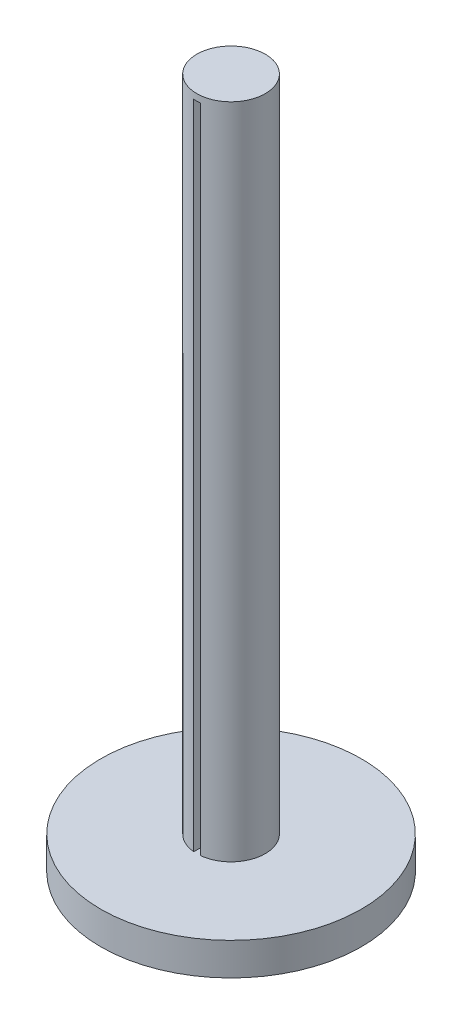
ISO-10303-21;
HEADER;
FILE_DESCRIPTION(('STEP AP214'),'2;1');
FILE_NAME('part.step','',(''),(''),'','','');
FILE_SCHEMA(('AUTOMOTIVE_DESIGN { 1 0 10303 214 1 1 1 1 }'));
ENDSEC;
DATA;
#1=APPLICATION_CONTEXT('core data for automotive mechanical design processes');
#2=APPLICATION_PROTOCOL_DEFINITION('international standard','automotive_design',2000,#1);
#3=PRODUCT_CONTEXT('',#1,'mechanical');
#4=PRODUCT('Part','Part','',(#3));
#5=PRODUCT_RELATED_PRODUCT_CATEGORY('part','',(#4));
#6=PRODUCT_DEFINITION_FORMATION('','',#4);
#7=PRODUCT_DEFINITION_CONTEXT('part definition',#1,'design');
#8=PRODUCT_DEFINITION('design','',#6,#7);
#9=PRODUCT_DEFINITION_SHAPE('','',#8);
#10=(LENGTH_UNIT() NAMED_UNIT(*) SI_UNIT(.MILLI.,.METRE.));
#11=(NAMED_UNIT(*) PLANE_ANGLE_UNIT() SI_UNIT($,.RADIAN.));
#12=(NAMED_UNIT(*) SI_UNIT($,.STERADIAN.) SOLID_ANGLE_UNIT());
#13=UNCERTAINTY_MEASURE_WITH_UNIT(LENGTH_MEASURE(1.E-05),#10,'distance_accuracy_value','');
#14=(GEOMETRIC_REPRESENTATION_CONTEXT(3) GLOBAL_UNCERTAINTY_ASSIGNED_CONTEXT((#13)) GLOBAL_UNIT_ASSIGNED_CONTEXT((#10,
#11,#12)) REPRESENTATION_CONTEXT('',''));
#15=CARTESIAN_POINT('',(0.,0.,0.));
#16=DIRECTION('',(0.,0.,1.));
#17=DIRECTION('',(1.,0.,0.));
#18=AXIS2_PLACEMENT_3D('',#15,#16,#17);
#19=CARTESIAN_POINT('',(-3.53710116751671E-12,50.0000000000016,0.));
#20=DIRECTION('',(0.,1.,0.));
#21=DIRECTION('',(0.,0.,-1.));
#22=AXIS2_PLACEMENT_3D('',#19,#20,#21);
#23=CYLINDRICAL_SURFACE('',#22,52.5);
#24=CARTESIAN_POINT('',(-3.53710116751671E-12,50.0000000000016,0.));
#25=DIRECTION('',(0.,-1.,0.));
#26=DIRECTION('',(0.,0.,1.));
#27=AXIS2_PLACEMENT_3D('',#24,#25,#26);
#28=CIRCLE('',#27,52.5);
#29=CARTESIAN_POINT('',(-5.00000000000355,50.0000000000016,52.2613624009172));
#30=VERTEX_POINT('',#29);
#31=CARTESIAN_POINT('',(4.99999999999645,50.0000000000016,52.2613624009172));
#32=VERTEX_POINT('',#31);
#33=EDGE_CURVE('E11',#30,#32,#28,.T.);
#34=ORIENTED_EDGE('',*,*,#33,.F.);
#35=DIRECTION('',(0.,-1.,0.));
#36=VECTOR('',#35,1.);
#37=CARTESIAN_POINT('',(-4.99999999999255,1050.,52.2613624009172));
#38=LINE('',#37,#36);
#39=CARTESIAN_POINT('',(-4.99999999999255,1050.,52.2613624009172));
#40=VERTEX_POINT('',#39);
#41=EDGE_CURVE('E79',#40,#30,#38,.T.);
#42=ORIENTED_EDGE('',*,*,#41,.F.);
#43=CARTESIAN_POINT('',(1.15516970988772E-11,1050.,0.));
#44=DIRECTION('',(0.,1.,0.));
#45=DIRECTION('',(-1.,0.,0.));
#46=AXIS2_PLACEMENT_3D('',#43,#44,#45);
#47=CIRCLE('',#46,52.499999999997);
#48=CARTESIAN_POINT('',(5.00000000000745,1050.,52.2613624009146));
#49=VERTEX_POINT('',#48);
#50=EDGE_CURVE('E86',#40,#49,#47,.T.);
#51=ORIENTED_EDGE('',*,*,#50,.T.);
#52=DIRECTION('',(0.,-1.,0.));
#53=VECTOR('',#52,1.);
#54=CARTESIAN_POINT('',(5.00000000000745,1050.,52.2613624009172));
#55=LINE('',#54,#53);
#56=EDGE_CURVE('E70',#49,#32,#55,.T.);
#57=ORIENTED_EDGE('',*,*,#56,.T.);
#58=EDGE_LOOP('',(#34,#42,#51,#57));
#59=FACE_BOUND('',#58,.T.);
#60=CARTESIAN_POINT('',(1.16617132617236E-11,1060.,0.));
#61=DIRECTION('',(0.,1.,0.));
#62=DIRECTION('',(-1.,0.,0.));
#63=AXIS2_PLACEMENT_3D('',#60,#61,#62);
#64=CIRCLE('',#63,52.499999999997);
#65=CARTESIAN_POINT('',(-52.4999999999853,1060.,0.));
#66=VERTEX_POINT('',#65);
#67=EDGE_CURVE('E92',#66,#66,#64,.T.);
#68=ORIENTED_EDGE('',*,*,#67,.F.);
#69=EDGE_LOOP('',(#68));
#70=FACE_BOUND('',#69,.T.);
#71=ADVANCED_FACE('F33',(#59,#70),#23,.T.);
#72=CARTESIAN_POINT('',(7.4645151171282E-12,1050.,0.));
#73=DIRECTION('',(0.,-1.,0.));
#74=DIRECTION('',(0.,0.,1.));
#75=AXIS2_PLACEMENT_3D('',#72,#73,#74);
#76=CYLINDRICAL_SURFACE('',#75,30.);
#77=CARTESIAN_POINT('',(-3.53710116751671E-12,50.0000000000016,0.));
#78=DIRECTION('',(0.,-1.,0.));
#79=DIRECTION('',(0.,0.,1.));
#80=AXIS2_PLACEMENT_3D('',#77,#78,#79);
#81=CIRCLE('',#80,30.);
#82=CARTESIAN_POINT('',(4.99999999999645,50.0000000000016,29.5803989154981));
#83=VERTEX_POINT('',#82);
#84=CARTESIAN_POINT('',(-5.00000000000355,50.0000000000016,29.5803989154981));
#85=VERTEX_POINT('',#84);
#86=EDGE_CURVE('E101',#83,#85,#81,.T.);
#87=ORIENTED_EDGE('',*,*,#86,.F.);
#88=DIRECTION('',(0.,-1.,0.));
#89=VECTOR('',#88,1.);
#90=CARTESIAN_POINT('',(5.00000000000746,1050.,29.5803989154981));
#91=LINE('',#90,#89);
#92=CARTESIAN_POINT('',(5.00000000000746,1050.,29.5803989154981));
#93=VERTEX_POINT('',#92);
#94=EDGE_CURVE('E80',#93,#83,#91,.T.);
#95=ORIENTED_EDGE('',*,*,#94,.F.);
#96=CARTESIAN_POINT('',(7.4645151171282E-12,1050.,0.));
#97=DIRECTION('',(0.,-1.,0.));
#98=DIRECTION('',(0.,0.,1.));
#99=AXIS2_PLACEMENT_3D('',#96,#97,#98);
#100=CIRCLE('',#99,30.);
#101=CARTESIAN_POINT('',(-4.99999999999255,1050.,29.5803989154981));
#102=VERTEX_POINT('',#101);
#103=EDGE_CURVE('E48',#93,#102,#100,.T.);
#104=ORIENTED_EDGE('',*,*,#103,.T.);
#105=DIRECTION('',(0.,-1.,0.));
#106=VECTOR('',#105,1.);
#107=CARTESIAN_POINT('',(-4.99999999999255,1050.,29.5803989154981));
#108=LINE('',#107,#106);
#109=EDGE_CURVE('E41',#102,#85,#108,.T.);
#110=ORIENTED_EDGE('',*,*,#109,.T.);
#111=EDGE_LOOP('',(#87,#95,#104,#110));
#112=FACE_BOUND('',#111,.T.);
#113=ADVANCED_FACE('F113',(#112),#76,.T.);
#114=CARTESIAN_POINT('',(-4.99999999999254,1050.,0.));
#115=DIRECTION('',(-1.,0.,0.));
#116=DIRECTION('',(0.,0.,-1.));
#117=AXIS2_PLACEMENT_3D('',#114,#115,#116);
#118=PLANE('',#117);
#119=DIRECTION('',(0.,0.,-1.));
#120=VECTOR('',#119,1.);
#121=CARTESIAN_POINT('',(-5.00000000000354,50.0000000000016,0.));
#122=LINE('',#121,#120);
#123=EDGE_CURVE('E104',#30,#85,#122,.T.);
#124=ORIENTED_EDGE('',*,*,#123,.T.);
#125=ORIENTED_EDGE('',*,*,#109,.F.);
#126=DIRECTION('',(0.,0.,-1.));
#127=VECTOR('',#126,1.);
#128=CARTESIAN_POINT('',(-4.99999999999254,1050.,0.));
#129=LINE('',#128,#127);
#130=EDGE_CURVE('E87',#40,#102,#129,.T.);
#131=ORIENTED_EDGE('',*,*,#130,.F.);
#132=ORIENTED_EDGE('',*,*,#41,.T.);
#133=EDGE_LOOP('',(#124,#125,#131,#132));
#134=FACE_BOUND('',#133,.T.);
#135=ADVANCED_FACE('F117',(#134),#118,.F.);
#136=CARTESIAN_POINT('',(5.00000000000746,1050.,0.));
#137=DIRECTION('',(1.,0.,0.));
#138=DIRECTION('',(0.,0.,1.));
#139=AXIS2_PLACEMENT_3D('',#136,#137,#138);
#140=PLANE('',#139);
#141=DIRECTION('',(0.,0.,1.));
#142=VECTOR('',#141,1.);
#143=CARTESIAN_POINT('',(4.99999999999646,50.0000000000016,0.));
#144=LINE('',#143,#142);
#145=EDGE_CURVE('E75',#83,#32,#144,.T.);
#146=ORIENTED_EDGE('',*,*,#145,.T.);
#147=ORIENTED_EDGE('',*,*,#56,.F.);
#148=DIRECTION('',(0.,0.,1.));
#149=VECTOR('',#148,1.);
#150=CARTESIAN_POINT('',(5.00000000000746,1050.,0.));
#151=LINE('',#150,#149);
#152=EDGE_CURVE('E74',#93,#49,#151,.T.);
#153=ORIENTED_EDGE('',*,*,#152,.F.);
#154=ORIENTED_EDGE('',*,*,#94,.T.);
#155=EDGE_LOOP('',(#146,#147,#153,#154));
#156=FACE_BOUND('',#155,.T.);
#157=ADVANCED_FACE('F72',(#156),#140,.F.);
#158=CARTESIAN_POINT('',(-3.53710116751671E-12,50.0000000000016,0.));
#159=DIRECTION('',(0.,-1.,0.));
#160=DIRECTION('',(0.,0.,1.));
#161=AXIS2_PLACEMENT_3D('',#158,#159,#160);
#162=PLANE('',#161);
#163=CARTESIAN_POINT('',(-3.53710116751671E-12,50.0000000000016,0.));
#164=DIRECTION('',(0.,-1.,0.));
#165=DIRECTION('',(0.,0.,1.));
#166=AXIS2_PLACEMENT_3D('',#163,#164,#165);
#167=CIRCLE('',#166,200.);
#168=CARTESIAN_POINT('',(-3.53710116751671E-12,50.0000000000016,200.));
#169=VERTEX_POINT('',#168);
#170=EDGE_CURVE('E95',#169,#169,#167,.T.);
#171=ORIENTED_EDGE('',*,*,#170,.F.);
#172=EDGE_LOOP('',(#171));
#173=FACE_BOUND('',#172,.T.);
#174=ORIENTED_EDGE('',*,*,#86,.T.);
#175=ORIENTED_EDGE('',*,*,#123,.F.);
#176=ORIENTED_EDGE('',*,*,#33,.T.);
#177=ORIENTED_EDGE('',*,*,#145,.F.);
#178=EDGE_LOOP('',(#174,#175,#176,#177));
#179=FACE_BOUND('',#178,.T.);
#180=ADVANCED_FACE('F115',(#173,#179),#162,.F.);
#181=CARTESIAN_POINT('',(-4.08718198174896E-12,1.55431223447522E-12,0.));
#182=DIRECTION('',(0.,1.,0.));
#183=DIRECTION('',(0.,0.,-1.));
#184=AXIS2_PLACEMENT_3D('',#181,#182,#183);
#185=CYLINDRICAL_SURFACE('',#184,200.);
#186=CARTESIAN_POINT('',(-4.08718198174896E-12,1.55431223447522E-12,0.));
#187=DIRECTION('',(0.,-1.,0.));
#188=DIRECTION('',(0.,0.,1.));
#189=AXIS2_PLACEMENT_3D('',#186,#187,#188);
#190=CIRCLE('',#189,200.);
#191=CARTESIAN_POINT('',(-4.08718198174896E-12,1.55431223447522E-12,200.));
#192=VERTEX_POINT('',#191);
#193=EDGE_CURVE('E98',#192,#192,#190,.T.);
#194=ORIENTED_EDGE('',*,*,#193,.F.);
#195=EDGE_LOOP('',(#194));
#196=FACE_BOUND('',#195,.T.);
#197=ORIENTED_EDGE('',*,*,#170,.T.);
#198=EDGE_LOOP('',(#197));
#199=FACE_BOUND('',#198,.T.);
#200=ADVANCED_FACE('F165',(#196,#199),#185,.T.);
#201=CARTESIAN_POINT('',(-4.08718198174896E-12,1.55431223447522E-12,0.));
#202=DIRECTION('',(0.,-1.,0.));
#203=DIRECTION('',(0.,0.,1.));
#204=AXIS2_PLACEMENT_3D('',#201,#202,#203);
#205=PLANE('',#204);
#206=ORIENTED_EDGE('',*,*,#193,.T.);
#207=EDGE_LOOP('',(#206));
#208=FACE_BOUND('',#207,.T.);
#209=ADVANCED_FACE('F134',(#208),#205,.T.);
#210=CARTESIAN_POINT('',(1.15516970988772E-11,1050.,0.));
#211=DIRECTION('',(0.,1.,0.));
#212=DIRECTION('',(-1.,0.,0.));
#213=AXIS2_PLACEMENT_3D('',#210,#211,#212);
#214=PLANE('',#213);
#215=ORIENTED_EDGE('',*,*,#50,.F.);
#216=ORIENTED_EDGE('',*,*,#130,.T.);
#217=ORIENTED_EDGE('',*,*,#103,.F.);
#218=ORIENTED_EDGE('',*,*,#152,.T.);
#219=EDGE_LOOP('',(#215,#216,#217,#218));
#220=FACE_BOUND('',#219,.T.);
#221=ADVANCED_FACE('F84',(#220),#214,.F.);
#222=CARTESIAN_POINT('',(1.16617132617236E-11,1060.,0.));
#223=DIRECTION('',(0.,1.,0.));
#224=DIRECTION('',(-1.,0.,0.));
#225=AXIS2_PLACEMENT_3D('',#222,#223,#224);
#226=PLANE('',#225);
#227=ORIENTED_EDGE('',*,*,#67,.T.);
#228=EDGE_LOOP('',(#227));
#229=FACE_BOUND('',#228,.T.);
#230=ADVANCED_FACE('F140',(#229),#226,.T.);
#231=CLOSED_SHELL('',(#71,#113,#135,#157,#180,#200,#209,#221,#230));
#232=MANIFOLD_SOLID_BREP('B2',#231);
#233=ADVANCED_BREP_SHAPE_REPRESENTATION('',(#18,#232),#14);
#234=SHAPE_DEFINITION_REPRESENTATION(#9,#233);
ENDSEC;
END-ISO-10303-21;
